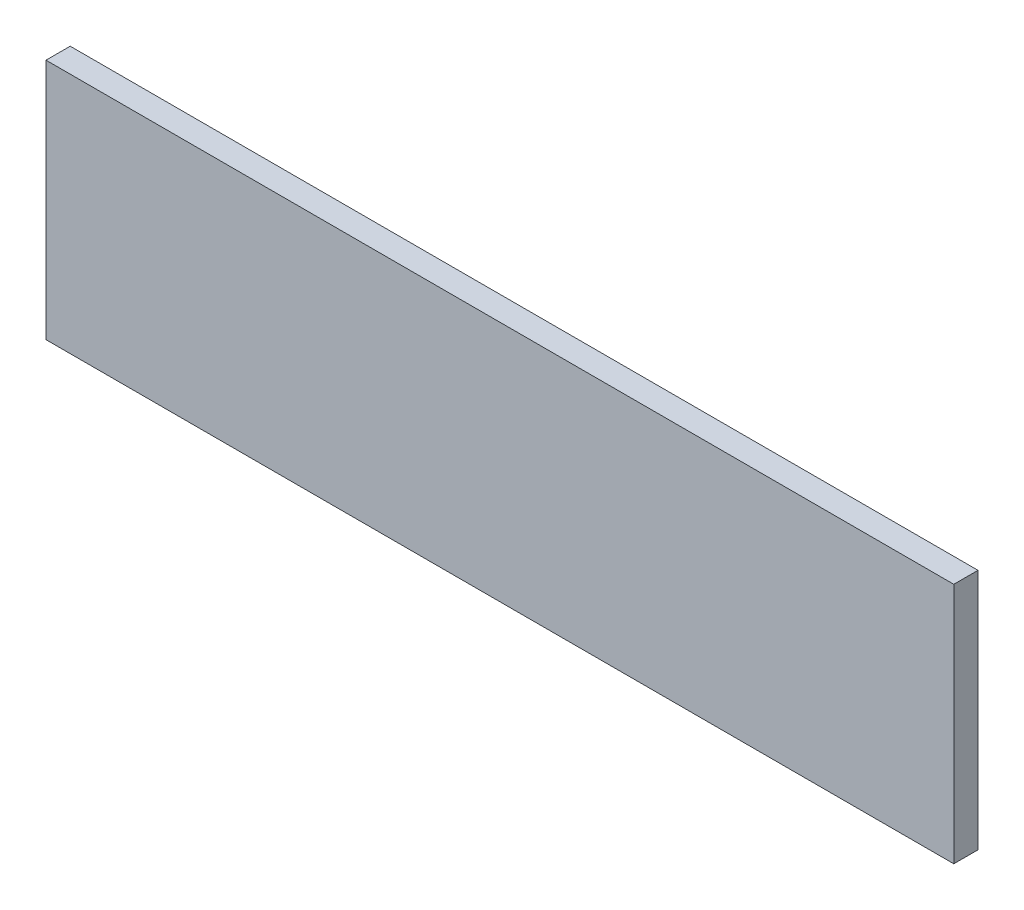
ISO-10303-21;
HEADER;
FILE_DESCRIPTION(('STEP AP214'),'2;1');
FILE_NAME('part.step','',(''),(''),'','','');
FILE_SCHEMA(('AUTOMOTIVE_DESIGN { 1 0 10303 214 1 1 1 1 }'));
ENDSEC;
DATA;
#1=APPLICATION_CONTEXT('core data for automotive mechanical design processes');
#2=APPLICATION_PROTOCOL_DEFINITION('international standard','automotive_design',2000,#1);
#3=PRODUCT_CONTEXT('',#1,'mechanical');
#4=PRODUCT('Part','Part','',(#3));
#5=PRODUCT_RELATED_PRODUCT_CATEGORY('part','',(#4));
#6=PRODUCT_DEFINITION_FORMATION('','',#4);
#7=PRODUCT_DEFINITION_CONTEXT('part definition',#1,'design');
#8=PRODUCT_DEFINITION('design','',#6,#7);
#9=PRODUCT_DEFINITION_SHAPE('','',#8);
#10=(LENGTH_UNIT() NAMED_UNIT(*) SI_UNIT(.MILLI.,.METRE.));
#11=(NAMED_UNIT(*) PLANE_ANGLE_UNIT() SI_UNIT($,.RADIAN.));
#12=(NAMED_UNIT(*) SI_UNIT($,.STERADIAN.) SOLID_ANGLE_UNIT());
#13=UNCERTAINTY_MEASURE_WITH_UNIT(LENGTH_MEASURE(1.E-05),#10,'distance_accuracy_value','');
#14=(GEOMETRIC_REPRESENTATION_CONTEXT(3) GLOBAL_UNCERTAINTY_ASSIGNED_CONTEXT((#13)) GLOBAL_UNIT_ASSIGNED_CONTEXT((#10,
#11,#12)) REPRESENTATION_CONTEXT('',''));
#15=CARTESIAN_POINT('',(0.,0.,0.));
#16=DIRECTION('',(0.,0.,1.));
#17=DIRECTION('',(1.,0.,0.));
#18=AXIS2_PLACEMENT_3D('',#15,#16,#17);
#19=CARTESIAN_POINT('',(-94.140601160674,21.7469632794638,5.08));
#20=DIRECTION('',(1.,0.,0.));
#21=DIRECTION('',(0.,0.,-1.));
#22=AXIS2_PLACEMENT_3D('',#19,#20,#21);
#23=PLANE('',#22);
#24=DIRECTION('',(0.,-1.,0.));
#25=VECTOR('',#24,1.);
#26=CARTESIAN_POINT('',(-94.140601160674,21.7469632794638,0.));
#27=LINE('',#26,#25);
#28=CARTESIAN_POINT('',(-94.140601160674,21.7469632794638,0.));
#29=VERTEX_POINT('',#28);
#30=CARTESIAN_POINT('',(-94.140601160674,-29.0530367205362,0.));
#31=VERTEX_POINT('',#30);
#32=EDGE_CURVE('E98',#29,#31,#27,.T.);
#33=ORIENTED_EDGE('',*,*,#32,.T.);
#34=DIRECTION('',(0.,0.,-1.));
#35=VECTOR('',#34,1.);
#36=CARTESIAN_POINT('',(-94.140601160674,-29.0530367205362,5.08));
#37=LINE('',#36,#35);
#38=CARTESIAN_POINT('',(-94.140601160674,-29.0530367205362,5.08));
#39=VERTEX_POINT('',#38);
#40=EDGE_CURVE('E11',#39,#31,#37,.T.);
#41=ORIENTED_EDGE('',*,*,#40,.F.);
#42=DIRECTION('',(0.,-1.,0.));
#43=VECTOR('',#42,1.);
#44=CARTESIAN_POINT('',(-94.140601160674,21.7469632794638,5.08));
#45=LINE('',#44,#43);
#46=CARTESIAN_POINT('',(-94.140601160674,21.7469632794638,5.08));
#47=VERTEX_POINT('',#46);
#48=EDGE_CURVE('E86',#47,#39,#45,.T.);
#49=ORIENTED_EDGE('',*,*,#48,.F.);
#50=DIRECTION('',(0.,0.,-1.));
#51=VECTOR('',#50,1.);
#52=CARTESIAN_POINT('',(-94.140601160674,21.7469632794638,5.08));
#53=LINE('',#52,#51);
#54=EDGE_CURVE('E94',#47,#29,#53,.T.);
#55=ORIENTED_EDGE('',*,*,#54,.T.);
#56=EDGE_LOOP('',(#33,#41,#49,#55));
#57=FACE_BOUND('',#56,.T.);
#58=ADVANCED_FACE('F35',(#57),#23,.F.);
#59=CARTESIAN_POINT('',(-94.140601160674,-29.0530367205362,5.08));
#60=DIRECTION('',(0.,1.,0.));
#61=DIRECTION('',(0.,0.,1.));
#62=AXIS2_PLACEMENT_3D('',#59,#60,#61);
#63=PLANE('',#62);
#64=DIRECTION('',(1.,0.,0.));
#65=VECTOR('',#64,1.);
#66=CARTESIAN_POINT('',(-94.140601160674,-29.0530367205362,0.));
#67=LINE('',#66,#65);
#68=CARTESIAN_POINT('',(96.359398839326,-29.0530367205362,0.));
#69=VERTEX_POINT('',#68);
#70=EDGE_CURVE('E90',#31,#69,#67,.T.);
#71=ORIENTED_EDGE('',*,*,#70,.T.);
#72=DIRECTION('',(0.,0.,-1.));
#73=VECTOR('',#72,1.);
#74=CARTESIAN_POINT('',(96.359398839326,-29.0530367205362,5.08));
#75=LINE('',#74,#73);
#76=CARTESIAN_POINT('',(96.359398839326,-29.0530367205362,5.08));
#77=VERTEX_POINT('',#76);
#78=EDGE_CURVE('E43',#77,#69,#75,.T.);
#79=ORIENTED_EDGE('',*,*,#78,.F.);
#80=DIRECTION('',(1.,0.,0.));
#81=VECTOR('',#80,1.);
#82=CARTESIAN_POINT('',(-94.140601160674,-29.0530367205362,5.08));
#83=LINE('',#82,#81);
#84=EDGE_CURVE('E81',#39,#77,#83,.T.);
#85=ORIENTED_EDGE('',*,*,#84,.F.);
#86=ORIENTED_EDGE('',*,*,#40,.T.);
#87=EDGE_LOOP('',(#71,#79,#85,#86));
#88=FACE_BOUND('',#87,.T.);
#89=ADVANCED_FACE('F89',(#88),#63,.F.);
#90=CARTESIAN_POINT('',(96.3593988393261,21.7469632794638,5.08));
#91=DIRECTION('',(-1.,0.,0.));
#92=DIRECTION('',(0.,-1.,0.));
#93=AXIS2_PLACEMENT_3D('',#90,#91,#92);
#94=PLANE('',#93);
#95=DIRECTION('',(0.,1.,0.));
#96=VECTOR('',#95,1.);
#97=CARTESIAN_POINT('',(96.3593988393261,21.7469632794638,0.));
#98=LINE('',#97,#96);
#99=CARTESIAN_POINT('',(96.3593988393261,21.7469632794638,0.));
#100=VERTEX_POINT('',#99);
#101=EDGE_CURVE('E68',#69,#100,#98,.T.);
#102=ORIENTED_EDGE('',*,*,#101,.T.);
#103=DIRECTION('',(0.,0.,-1.));
#104=VECTOR('',#103,1.);
#105=CARTESIAN_POINT('',(96.3593988393261,21.7469632794638,5.08));
#106=LINE('',#105,#104);
#107=CARTESIAN_POINT('',(96.3593988393261,21.7469632794638,5.08));
#108=VERTEX_POINT('',#107);
#109=EDGE_CURVE('E91',#108,#100,#106,.T.);
#110=ORIENTED_EDGE('',*,*,#109,.F.);
#111=DIRECTION('',(0.,1.,0.));
#112=VECTOR('',#111,1.);
#113=CARTESIAN_POINT('',(96.3593988393261,21.7469632794638,5.08));
#114=LINE('',#113,#112);
#115=EDGE_CURVE('E84',#77,#108,#114,.T.);
#116=ORIENTED_EDGE('',*,*,#115,.F.);
#117=ORIENTED_EDGE('',*,*,#78,.T.);
#118=EDGE_LOOP('',(#102,#110,#116,#117));
#119=FACE_BOUND('',#118,.T.);
#120=ADVANCED_FACE('F92',(#119),#94,.F.);
#121=CARTESIAN_POINT('',(-94.140601160674,21.7469632794638,5.08));
#122=DIRECTION('',(0.,-1.,0.));
#123=DIRECTION('',(0.,0.,-1.));
#124=AXIS2_PLACEMENT_3D('',#121,#122,#123);
#125=PLANE('',#124);
#126=DIRECTION('',(-1.,0.,0.));
#127=VECTOR('',#126,1.);
#128=CARTESIAN_POINT('',(-94.140601160674,21.7469632794638,0.));
#129=LINE('',#128,#127);
#130=EDGE_CURVE('E74',#100,#29,#129,.T.);
#131=ORIENTED_EDGE('',*,*,#130,.T.);
#132=ORIENTED_EDGE('',*,*,#54,.F.);
#133=DIRECTION('',(-1.,0.,0.));
#134=VECTOR('',#133,1.);
#135=CARTESIAN_POINT('',(-94.140601160674,21.7469632794638,5.08));
#136=LINE('',#135,#134);
#137=EDGE_CURVE('E51',#108,#47,#136,.T.);
#138=ORIENTED_EDGE('',*,*,#137,.F.);
#139=ORIENTED_EDGE('',*,*,#109,.T.);
#140=EDGE_LOOP('',(#131,#132,#138,#139));
#141=FACE_BOUND('',#140,.T.);
#142=ADVANCED_FACE('F105',(#141),#125,.F.);
#143=CARTESIAN_POINT('',(0.,0.,5.08));
#144=DIRECTION('',(0.,0.,1.));
#145=DIRECTION('',(1.,0.,0.));
#146=AXIS2_PLACEMENT_3D('',#143,#144,#145);
#147=PLANE('',#146);
#148=ORIENTED_EDGE('',*,*,#48,.T.);
#149=ORIENTED_EDGE('',*,*,#84,.T.);
#150=ORIENTED_EDGE('',*,*,#115,.T.);
#151=ORIENTED_EDGE('',*,*,#137,.T.);
#152=EDGE_LOOP('',(#148,#149,#150,#151));
#153=FACE_BOUND('',#152,.T.);
#154=ADVANCED_FACE('F82',(#153),#147,.T.);
#155=CARTESIAN_POINT('',(0.,0.,0.));
#156=DIRECTION('',(0.,0.,1.));
#157=DIRECTION('',(1.,0.,0.));
#158=AXIS2_PLACEMENT_3D('',#155,#156,#157);
#159=PLANE('',#158);
#160=ORIENTED_EDGE('',*,*,#32,.F.);
#161=ORIENTED_EDGE('',*,*,#130,.F.);
#162=ORIENTED_EDGE('',*,*,#101,.F.);
#163=ORIENTED_EDGE('',*,*,#70,.F.);
#164=EDGE_LOOP('',(#160,#161,#162,#163));
#165=FACE_BOUND('',#164,.T.);
#166=ADVANCED_FACE('F108',(#165),#159,.F.);
#167=CLOSED_SHELL('',(#58,#89,#120,#142,#154,#166));
#168=MANIFOLD_SOLID_BREP('B2',#167);
#169=ADVANCED_BREP_SHAPE_REPRESENTATION('',(#18,#168),#14);
#170=SHAPE_DEFINITION_REPRESENTATION(#9,#169);
ENDSEC;
END-ISO-10303-21;
